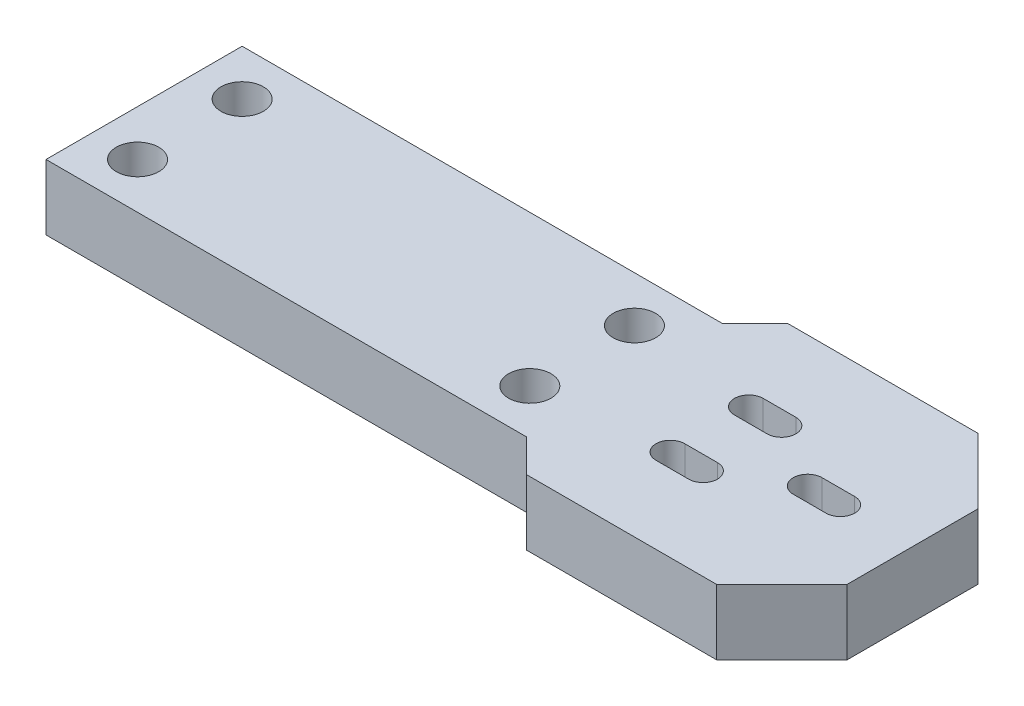
ISO-10303-21;
HEADER;
FILE_DESCRIPTION(('STEP AP214'),'2;1');
FILE_NAME('part.step','',(''),(''),'','','');
FILE_SCHEMA(('AUTOMOTIVE_DESIGN { 1 0 10303 214 1 1 1 1 }'));
ENDSEC;
DATA;
#1=APPLICATION_CONTEXT('core data for automotive mechanical design processes');
#2=APPLICATION_PROTOCOL_DEFINITION('international standard','automotive_design',2000,#1);
#3=PRODUCT_CONTEXT('',#1,'mechanical');
#4=PRODUCT('Part','Part','',(#3));
#5=PRODUCT_RELATED_PRODUCT_CATEGORY('part','',(#4));
#6=PRODUCT_DEFINITION_FORMATION('','',#4);
#7=PRODUCT_DEFINITION_CONTEXT('part definition',#1,'design');
#8=PRODUCT_DEFINITION('design','',#6,#7);
#9=PRODUCT_DEFINITION_SHAPE('','',#8);
#10=(LENGTH_UNIT() NAMED_UNIT(*) SI_UNIT(.MILLI.,.METRE.));
#11=(NAMED_UNIT(*) PLANE_ANGLE_UNIT() SI_UNIT($,.RADIAN.));
#12=(NAMED_UNIT(*) SI_UNIT($,.STERADIAN.) SOLID_ANGLE_UNIT());
#13=UNCERTAINTY_MEASURE_WITH_UNIT(LENGTH_MEASURE(1.E-05),#10,'distance_accuracy_value','');
#14=(GEOMETRIC_REPRESENTATION_CONTEXT(3) GLOBAL_UNCERTAINTY_ASSIGNED_CONTEXT((#13)) GLOBAL_UNIT_ASSIGNED_CONTEXT((#10,
#11,#12)) REPRESENTATION_CONTEXT('',''));
#15=CARTESIAN_POINT('',(0.,0.,0.));
#16=DIRECTION('',(0.,0.,1.));
#17=DIRECTION('',(1.,0.,0.));
#18=AXIS2_PLACEMENT_3D('',#15,#16,#17);
#19=CARTESIAN_POINT('',(0.,10.,0.));
#20=DIRECTION('',(0.,1.,0.));
#21=DIRECTION('',(0.,0.,1.));
#22=AXIS2_PLACEMENT_3D('',#19,#20,#21);
#23=PLANE('',#22);
#24=CARTESIAN_POINT('',(60.,10.,0.));
#25=DIRECTION('',(0.,1.,0.));
#26=DIRECTION('',(0.,0.,1.));
#27=AXIS2_PLACEMENT_3D('',#24,#25,#26);
#28=CIRCLE('',#27,3.25000000000001);
#29=CARTESIAN_POINT('',(60.,10.,3.25000000000001));
#30=VERTEX_POINT('',#29);
#31=EDGE_CURVE('E292',#30,#30,#28,.T.);
#32=ORIENTED_EDGE('',*,*,#31,.F.);
#33=EDGE_LOOP('',(#32));
#34=FACE_BOUND('',#33,.T.);
#35=CARTESIAN_POINT('',(0.,10.,0.));
#36=DIRECTION('',(0.,1.,0.));
#37=DIRECTION('',(0.,0.,1.));
#38=AXIS2_PLACEMENT_3D('',#35,#36,#37);
#39=CIRCLE('',#38,3.25);
#40=CARTESIAN_POINT('',(0.,10.,3.25));
#41=VERTEX_POINT('',#40);
#42=EDGE_CURVE('E304',#41,#41,#39,.T.);
#43=ORIENTED_EDGE('',*,*,#42,.F.);
#44=EDGE_LOOP('',(#43));
#45=FACE_BOUND('',#44,.T.);
#46=DIRECTION('',(1.,0.,0.));
#47=VECTOR('',#46,1.);
#48=CARTESIAN_POINT('',(66.5,10.,7.));
#49=LINE('',#48,#47);
#50=CARTESIAN_POINT('',(-7.,10.,7.));
#51=VERTEX_POINT('',#50);
#52=CARTESIAN_POINT('',(66.5,10.,7.));
#53=VERTEX_POINT('',#52);
#54=EDGE_CURVE('E316',#51,#53,#49,.T.);
#55=ORIENTED_EDGE('',*,*,#54,.T.);
#56=DIRECTION('',(-0.707106781186546,0.,-0.707106781186549));
#57=VECTOR('',#56,1.);
#58=CARTESIAN_POINT('',(29.7500000000001,10.,-29.75));
#59=LINE('',#58,#57);
#60=CARTESIAN_POINT('',(71.5,10.,12.));
#61=VERTEX_POINT('',#60);
#62=EDGE_CURVE('E41',#53,#61,#59,.F.);
#63=ORIENTED_EDGE('',*,*,#62,.T.);
#64=DIRECTION('',(1.,0.,0.));
#65=VECTOR('',#64,1.);
#66=CARTESIAN_POINT('',(110.551844539582,10.,12.));
#67=LINE('',#66,#65);
#68=CARTESIAN_POINT('',(100.551844539582,10.,12.));
#69=VERTEX_POINT('',#68);
#70=EDGE_CURVE('E318',#61,#69,#67,.T.);
#71=ORIENTED_EDGE('',*,*,#70,.T.);
#72=DIRECTION('',(-0.707106781186548,0.,0.707106781186547));
#73=VECTOR('',#72,1.);
#74=CARTESIAN_POINT('',(56.2759222697907,10.,56.2759222697909));
#75=LINE('',#74,#73);
#76=CARTESIAN_POINT('',(110.551844539582,10.,2.00000000000001));
#77=VERTEX_POINT('',#76);
#78=EDGE_CURVE('E365',#69,#77,#75,.F.);
#79=ORIENTED_EDGE('',*,*,#78,.T.);
#80=DIRECTION('',(0.,0.,-1.));
#81=VECTOR('',#80,1.);
#82=CARTESIAN_POINT('',(110.551844539582,10.,-28.));
#83=LINE('',#82,#81);
#84=CARTESIAN_POINT('',(110.551844539582,10.,-18.));
#85=VERTEX_POINT('',#84);
#86=EDGE_CURVE('E320',#77,#85,#83,.T.);
#87=ORIENTED_EDGE('',*,*,#86,.T.);
#88=DIRECTION('',(0.707106781186546,0.,0.70710678118655));
#89=VECTOR('',#88,1.);
#90=CARTESIAN_POINT('',(64.2759222697912,10.,-64.2759222697908));
#91=LINE('',#90,#89);
#92=CARTESIAN_POINT('',(100.551844539582,10.,-28.));
#93=VERTEX_POINT('',#92);
#94=EDGE_CURVE('E363',#85,#93,#91,.F.);
#95=ORIENTED_EDGE('',*,*,#94,.T.);
#96=DIRECTION('',(-1.,0.,0.));
#97=VECTOR('',#96,1.);
#98=CARTESIAN_POINT('',(66.5,10.,-28.));
#99=LINE('',#98,#97);
#100=CARTESIAN_POINT('',(71.5,10.,-28.));
#101=VERTEX_POINT('',#100);
#102=EDGE_CURVE('E323',#93,#101,#99,.T.);
#103=ORIENTED_EDGE('',*,*,#102,.T.);
#104=DIRECTION('',(0.707106781186549,0.,-0.707106781186547));
#105=VECTOR('',#104,1.);
#106=CARTESIAN_POINT('',(21.7499999999999,10.,21.75));
#107=LINE('',#106,#105);
#108=CARTESIAN_POINT('',(66.5,10.,-23.));
#109=VERTEX_POINT('',#108);
#110=EDGE_CURVE('E376',#101,#109,#107,.F.);
#111=ORIENTED_EDGE('',*,*,#110,.T.);
#112=DIRECTION('',(-1.,0.,0.));
#113=VECTOR('',#112,1.);
#114=CARTESIAN_POINT('',(-7.,10.,-23.));
#115=LINE('',#114,#113);
#116=CARTESIAN_POINT('',(-7.,10.,-23.));
#117=VERTEX_POINT('',#116);
#118=EDGE_CURVE('E310',#109,#117,#115,.T.);
#119=ORIENTED_EDGE('',*,*,#118,.T.);
#120=DIRECTION('',(0.,0.,1.));
#121=VECTOR('',#120,1.);
#122=CARTESIAN_POINT('',(-7.,10.,-23.));
#123=LINE('',#122,#121);
#124=EDGE_CURVE('E313',#117,#51,#123,.T.);
#125=ORIENTED_EDGE('',*,*,#124,.T.);
#126=EDGE_LOOP('',(#55,#63,#71,#79,#87,#95,#103,#111,#119,#125));
#127=FACE_BOUND('',#126,.T.);
#128=CARTESIAN_POINT('',(0.,10.,-16.));
#129=DIRECTION('',(0.,1.,0.));
#130=DIRECTION('',(0.,0.,1.));
#131=AXIS2_PLACEMENT_3D('',#128,#129,#130);
#132=CIRCLE('',#131,3.25);
#133=CARTESIAN_POINT('',(0.,10.,-12.75));
#134=VERTEX_POINT('',#133);
#135=EDGE_CURVE('E298',#134,#134,#132,.T.);
#136=ORIENTED_EDGE('',*,*,#135,.F.);
#137=EDGE_LOOP('',(#136));
#138=FACE_BOUND('',#137,.T.);
#139=CARTESIAN_POINT('',(60.,10.,-16.));
#140=DIRECTION('',(0.,1.,0.));
#141=DIRECTION('',(0.,0.,1.));
#142=AXIS2_PLACEMENT_3D('',#139,#140,#141);
#143=CIRCLE('',#142,3.25000000000001);
#144=CARTESIAN_POINT('',(60.,10.,-12.75));
#145=VERTEX_POINT('',#144);
#146=EDGE_CURVE('E286',#145,#145,#143,.T.);
#147=ORIENTED_EDGE('',*,*,#146,.F.);
#148=EDGE_LOOP('',(#147));
#149=FACE_BOUND('',#148,.T.);
#150=DIRECTION('',(-1.,0.,0.));
#151=VECTOR('',#150,1.);
#152=CARTESIAN_POINT('',(99.5,10.,-10.2));
#153=LINE('',#152,#151);
#154=CARTESIAN_POINT('',(99.5,10.,-10.2));
#155=VERTEX_POINT('',#154);
#156=CARTESIAN_POINT('',(94.5,10.,-10.2));
#157=VERTEX_POINT('',#156);
#158=EDGE_CURVE('E257',#155,#157,#153,.T.);
#159=ORIENTED_EDGE('',*,*,#158,.F.);
#160=CARTESIAN_POINT('',(99.5,10.,-8.));
#161=DIRECTION('',(0.,1.,0.));
#162=DIRECTION('',(0.,0.,1.));
#163=AXIS2_PLACEMENT_3D('',#160,#161,#162);
#164=CIRCLE('',#163,2.2);
#165=CARTESIAN_POINT('',(99.5,10.,-5.8));
#166=VERTEX_POINT('',#165);
#167=EDGE_CURVE('E255',#166,#155,#164,.T.);
#168=ORIENTED_EDGE('',*,*,#167,.F.);
#169=DIRECTION('',(1.,0.,0.));
#170=VECTOR('',#169,1.);
#171=CARTESIAN_POINT('',(99.5,10.,-5.8));
#172=LINE('',#171,#170);
#173=CARTESIAN_POINT('',(94.5,10.,-5.8));
#174=VERTEX_POINT('',#173);
#175=EDGE_CURVE('E263',#174,#166,#172,.T.);
#176=ORIENTED_EDGE('',*,*,#175,.F.);
#177=CARTESIAN_POINT('',(94.5,10.,-8.));
#178=DIRECTION('',(0.,1.,0.));
#179=DIRECTION('',(0.,0.,1.));
#180=AXIS2_PLACEMENT_3D('',#177,#178,#179);
#181=CIRCLE('',#180,2.2);
#182=EDGE_CURVE('E260',#157,#174,#181,.T.);
#183=ORIENTED_EDGE('',*,*,#182,.F.);
#184=EDGE_LOOP('',(#159,#168,#176,#183));
#185=FACE_BOUND('',#184,.T.);
#186=DIRECTION('',(-1.,0.,0.));
#187=VECTOR('',#186,1.);
#188=CARTESIAN_POINT('',(84.5,10.,-16.2));
#189=LINE('',#188,#187);
#190=CARTESIAN_POINT('',(84.5,10.,-16.2));
#191=VERTEX_POINT('',#190);
#192=CARTESIAN_POINT('',(79.5,10.,-16.2));
#193=VERTEX_POINT('',#192);
#194=EDGE_CURVE('E226',#191,#193,#189,.T.);
#195=ORIENTED_EDGE('',*,*,#194,.F.);
#196=CARTESIAN_POINT('',(84.5,10.,-14.));
#197=DIRECTION('',(0.,1.,0.));
#198=DIRECTION('',(0.,0.,1.));
#199=AXIS2_PLACEMENT_3D('',#196,#197,#198);
#200=CIRCLE('',#199,2.2);
#201=CARTESIAN_POINT('',(84.5,10.,-11.8));
#202=VERTEX_POINT('',#201);
#203=EDGE_CURVE('E224',#202,#191,#200,.T.);
#204=ORIENTED_EDGE('',*,*,#203,.F.);
#205=DIRECTION('',(1.,0.,0.));
#206=VECTOR('',#205,1.);
#207=CARTESIAN_POINT('',(84.5,10.,-11.8));
#208=LINE('',#207,#206);
#209=CARTESIAN_POINT('',(79.5,10.,-11.8));
#210=VERTEX_POINT('',#209);
#211=EDGE_CURVE('E232',#210,#202,#208,.T.);
#212=ORIENTED_EDGE('',*,*,#211,.F.);
#213=CARTESIAN_POINT('',(79.5,10.,-14.));
#214=DIRECTION('',(0.,1.,0.));
#215=DIRECTION('',(0.,0.,1.));
#216=AXIS2_PLACEMENT_3D('',#213,#214,#215);
#217=CIRCLE('',#216,2.2);
#218=EDGE_CURVE('E229',#193,#210,#217,.T.);
#219=ORIENTED_EDGE('',*,*,#218,.F.);
#220=EDGE_LOOP('',(#195,#204,#212,#219));
#221=FACE_BOUND('',#220,.T.);
#222=DIRECTION('',(-1.,0.,0.));
#223=VECTOR('',#222,1.);
#224=CARTESIAN_POINT('',(84.5,10.,-4.2));
#225=LINE('',#224,#223);
#226=CARTESIAN_POINT('',(84.5,10.,-4.2));
#227=VERTEX_POINT('',#226);
#228=CARTESIAN_POINT('',(79.5,10.,-4.2));
#229=VERTEX_POINT('',#228);
#230=EDGE_CURVE('E193',#227,#229,#225,.T.);
#231=ORIENTED_EDGE('',*,*,#230,.F.);
#232=CARTESIAN_POINT('',(84.5,10.,-2.));
#233=DIRECTION('',(0.,1.,0.));
#234=DIRECTION('',(0.,0.,1.));
#235=AXIS2_PLACEMENT_3D('',#232,#233,#234);
#236=CIRCLE('',#235,2.2);
#237=CARTESIAN_POINT('',(84.5,10.,0.200000000000003));
#238=VERTEX_POINT('',#237);
#239=EDGE_CURVE('E183',#238,#227,#236,.T.);
#240=ORIENTED_EDGE('',*,*,#239,.F.);
#241=DIRECTION('',(1.,0.,0.));
#242=VECTOR('',#241,1.);
#243=CARTESIAN_POINT('',(84.5,10.,0.200000000000003));
#244=LINE('',#243,#242);
#245=CARTESIAN_POINT('',(79.5,10.,0.200000000000004));
#246=VERTEX_POINT('',#245);
#247=EDGE_CURVE('E208',#246,#238,#244,.T.);
#248=ORIENTED_EDGE('',*,*,#247,.F.);
#249=CARTESIAN_POINT('',(79.5,10.,-2.));
#250=DIRECTION('',(0.,1.,0.));
#251=DIRECTION('',(0.,0.,1.));
#252=AXIS2_PLACEMENT_3D('',#249,#250,#251);
#253=CIRCLE('',#252,2.2);
#254=EDGE_CURVE('E206',#229,#246,#253,.T.);
#255=ORIENTED_EDGE('',*,*,#254,.F.);
#256=EDGE_LOOP('',(#231,#240,#248,#255));
#257=FACE_BOUND('',#256,.T.);
#258=ADVANCED_FACE('F33',(#34,#45,#127,#138,#149,#185,#221,#257),#23,.T.);
#259=CARTESIAN_POINT('',(0.,0.,0.));
#260=DIRECTION('',(0.,1.,0.));
#261=DIRECTION('',(0.,0.,1.));
#262=AXIS2_PLACEMENT_3D('',#259,#260,#261);
#263=PLANE('',#262);
#264=CARTESIAN_POINT('',(84.5,0.,-14.));
#265=DIRECTION('',(0.,1.,0.));
#266=DIRECTION('',(0.,0.,1.));
#267=AXIS2_PLACEMENT_3D('',#264,#265,#266);
#268=CIRCLE('',#267,2.2);
#269=CARTESIAN_POINT('',(84.5,0.,-11.8));
#270=VERTEX_POINT('',#269);
#271=CARTESIAN_POINT('',(84.5,0.,-16.2));
#272=VERTEX_POINT('',#271);
#273=EDGE_CURVE('E201',#270,#272,#268,.T.);
#274=ORIENTED_EDGE('',*,*,#273,.T.);
#275=DIRECTION('',(-1.,0.,0.));
#276=VECTOR('',#275,1.);
#277=CARTESIAN_POINT('',(84.5,0.,-16.2));
#278=LINE('',#277,#276);
#279=CARTESIAN_POINT('',(79.5,0.,-16.2));
#280=VERTEX_POINT('',#279);
#281=EDGE_CURVE('E237',#272,#280,#278,.T.);
#282=ORIENTED_EDGE('',*,*,#281,.T.);
#283=CARTESIAN_POINT('',(79.5,0.,-14.));
#284=DIRECTION('',(0.,1.,0.));
#285=DIRECTION('',(0.,0.,1.));
#286=AXIS2_PLACEMENT_3D('',#283,#284,#285);
#287=CIRCLE('',#286,2.2);
#288=CARTESIAN_POINT('',(79.5,0.,-11.8));
#289=VERTEX_POINT('',#288);
#290=EDGE_CURVE('E240',#280,#289,#287,.T.);
#291=ORIENTED_EDGE('',*,*,#290,.T.);
#292=DIRECTION('',(1.,0.,0.));
#293=VECTOR('',#292,1.);
#294=CARTESIAN_POINT('',(84.5,0.,-11.8));
#295=LINE('',#294,#293);
#296=EDGE_CURVE('E227',#289,#270,#295,.T.);
#297=ORIENTED_EDGE('',*,*,#296,.T.);
#298=EDGE_LOOP('',(#274,#282,#291,#297));
#299=FACE_BOUND('',#298,.T.);
#300=CARTESIAN_POINT('',(60.,0.,-16.));
#301=DIRECTION('',(0.,1.,0.));
#302=DIRECTION('',(0.,0.,1.));
#303=AXIS2_PLACEMENT_3D('',#300,#301,#302);
#304=CIRCLE('',#303,3.25000000000001);
#305=CARTESIAN_POINT('',(60.,0.,-12.75));
#306=VERTEX_POINT('',#305);
#307=EDGE_CURVE('E285',#306,#306,#304,.T.);
#308=ORIENTED_EDGE('',*,*,#307,.T.);
#309=EDGE_LOOP('',(#308));
#310=FACE_BOUND('',#309,.T.);
#311=CARTESIAN_POINT('',(60.,0.,0.));
#312=DIRECTION('',(0.,1.,0.));
#313=DIRECTION('',(0.,0.,1.));
#314=AXIS2_PLACEMENT_3D('',#311,#312,#313);
#315=CIRCLE('',#314,3.25000000000001);
#316=CARTESIAN_POINT('',(60.,0.,3.25000000000001));
#317=VERTEX_POINT('',#316);
#318=EDGE_CURVE('E289',#317,#317,#315,.T.);
#319=ORIENTED_EDGE('',*,*,#318,.T.);
#320=EDGE_LOOP('',(#319));
#321=FACE_BOUND('',#320,.T.);
#322=CARTESIAN_POINT('',(0.,0.,-16.));
#323=DIRECTION('',(0.,1.,0.));
#324=DIRECTION('',(0.,0.,1.));
#325=AXIS2_PLACEMENT_3D('',#322,#323,#324);
#326=CIRCLE('',#325,3.25);
#327=CARTESIAN_POINT('',(0.,0.,-12.75));
#328=VERTEX_POINT('',#327);
#329=EDGE_CURVE('E295',#328,#328,#326,.T.);
#330=ORIENTED_EDGE('',*,*,#329,.T.);
#331=EDGE_LOOP('',(#330));
#332=FACE_BOUND('',#331,.T.);
#333=CARTESIAN_POINT('',(0.,0.,0.));
#334=DIRECTION('',(0.,1.,0.));
#335=DIRECTION('',(0.,0.,1.));
#336=AXIS2_PLACEMENT_3D('',#333,#334,#335);
#337=CIRCLE('',#336,3.25);
#338=CARTESIAN_POINT('',(0.,0.,3.25));
#339=VERTEX_POINT('',#338);
#340=EDGE_CURVE('E301',#339,#339,#337,.T.);
#341=ORIENTED_EDGE('',*,*,#340,.T.);
#342=EDGE_LOOP('',(#341));
#343=FACE_BOUND('',#342,.T.);
#344=DIRECTION('',(1.,0.,0.));
#345=VECTOR('',#344,1.);
#346=CARTESIAN_POINT('',(110.551844539582,0.,12.));
#347=LINE('',#346,#345);
#348=CARTESIAN_POINT('',(71.5,0.,12.));
#349=VERTEX_POINT('',#348);
#350=CARTESIAN_POINT('',(100.551844539582,0.,12.));
#351=VERTEX_POINT('',#350);
#352=EDGE_CURVE('E333',#349,#351,#347,.T.);
#353=ORIENTED_EDGE('',*,*,#352,.F.);
#354=DIRECTION('',(0.707106781186546,0.,0.707106781186549));
#355=VECTOR('',#354,1.);
#356=CARTESIAN_POINT('',(71.5,0.,12.));
#357=LINE('',#356,#355);
#358=CARTESIAN_POINT('',(66.5,0.,7.));
#359=VERTEX_POINT('',#358);
#360=EDGE_CURVE('E374',#349,#359,#357,.F.);
#361=ORIENTED_EDGE('',*,*,#360,.T.);
#362=DIRECTION('',(1.,0.,0.));
#363=VECTOR('',#362,1.);
#364=CARTESIAN_POINT('',(66.5,0.,7.));
#365=LINE('',#364,#363);
#366=CARTESIAN_POINT('',(-7.,0.,7.));
#367=VERTEX_POINT('',#366);
#368=EDGE_CURVE('E330',#367,#359,#365,.T.);
#369=ORIENTED_EDGE('',*,*,#368,.F.);
#370=DIRECTION('',(0.,0.,1.));
#371=VECTOR('',#370,1.);
#372=CARTESIAN_POINT('',(-7.,0.,-23.));
#373=LINE('',#372,#371);
#374=CARTESIAN_POINT('',(-7.,0.,-23.));
#375=VERTEX_POINT('',#374);
#376=EDGE_CURVE('E328',#375,#367,#373,.T.);
#377=ORIENTED_EDGE('',*,*,#376,.F.);
#378=DIRECTION('',(-1.,0.,0.));
#379=VECTOR('',#378,1.);
#380=CARTESIAN_POINT('',(-7.,0.,-23.));
#381=LINE('',#380,#379);
#382=CARTESIAN_POINT('',(66.5,0.,-23.));
#383=VERTEX_POINT('',#382);
#384=EDGE_CURVE('E307',#383,#375,#381,.T.);
#385=ORIENTED_EDGE('',*,*,#384,.F.);
#386=DIRECTION('',(-0.707106781186549,0.,0.707106781186547));
#387=VECTOR('',#386,1.);
#388=CARTESIAN_POINT('',(66.5,0.,-23.));
#389=LINE('',#388,#387);
#390=CARTESIAN_POINT('',(71.5,0.,-28.));
#391=VERTEX_POINT('',#390);
#392=EDGE_CURVE('E54',#383,#391,#389,.F.);
#393=ORIENTED_EDGE('',*,*,#392,.T.);
#394=DIRECTION('',(-1.,0.,0.));
#395=VECTOR('',#394,1.);
#396=CARTESIAN_POINT('',(66.5,0.,-28.));
#397=LINE('',#396,#395);
#398=CARTESIAN_POINT('',(100.551844539582,0.,-28.));
#399=VERTEX_POINT('',#398);
#400=EDGE_CURVE('E314',#399,#391,#397,.T.);
#401=ORIENTED_EDGE('',*,*,#400,.F.);
#402=DIRECTION('',(-0.707106781186546,0.,-0.70710678118655));
#403=VECTOR('',#402,1.);
#404=CARTESIAN_POINT('',(100.551844539582,0.,-28.));
#405=LINE('',#404,#403);
#406=CARTESIAN_POINT('',(110.551844539582,0.,-18.));
#407=VERTEX_POINT('',#406);
#408=EDGE_CURVE('E355',#399,#407,#405,.F.);
#409=ORIENTED_EDGE('',*,*,#408,.T.);
#410=DIRECTION('',(0.,0.,-1.));
#411=VECTOR('',#410,1.);
#412=CARTESIAN_POINT('',(110.551844539582,0.,-28.));
#413=LINE('',#412,#411);
#414=CARTESIAN_POINT('',(110.551844539582,0.,2.00000000000001));
#415=VERTEX_POINT('',#414);
#416=EDGE_CURVE('E335',#415,#407,#413,.T.);
#417=ORIENTED_EDGE('',*,*,#416,.F.);
#418=DIRECTION('',(0.707106781186548,0.,-0.707106781186547));
#419=VECTOR('',#418,1.);
#420=CARTESIAN_POINT('',(110.551844539582,0.,2.00000000000001));
#421=LINE('',#420,#419);
#422=EDGE_CURVE('E357',#415,#351,#421,.F.);
#423=ORIENTED_EDGE('',*,*,#422,.T.);
#424=EDGE_LOOP('',(#353,#361,#369,#377,#385,#393,#401,#409,#417,#423));
#425=FACE_BOUND('',#424,.T.);
#426=CARTESIAN_POINT('',(99.5,0.,-8.));
#427=DIRECTION('',(0.,1.,0.));
#428=DIRECTION('',(0.,0.,1.));
#429=AXIS2_PLACEMENT_3D('',#426,#427,#428);
#430=CIRCLE('',#429,2.2);
#431=CARTESIAN_POINT('',(99.5,0.,-5.8));
#432=VERTEX_POINT('',#431);
#433=CARTESIAN_POINT('',(99.5,0.,-10.2));
#434=VERTEX_POINT('',#433);
#435=EDGE_CURVE('E254',#432,#434,#430,.T.);
#436=ORIENTED_EDGE('',*,*,#435,.T.);
#437=DIRECTION('',(-1.,0.,0.));
#438=VECTOR('',#437,1.);
#439=CARTESIAN_POINT('',(99.5,0.,-10.2));
#440=LINE('',#439,#438);
#441=CARTESIAN_POINT('',(94.5,0.,-10.2));
#442=VERTEX_POINT('',#441);
#443=EDGE_CURVE('E268',#434,#442,#440,.T.);
#444=ORIENTED_EDGE('',*,*,#443,.T.);
#445=CARTESIAN_POINT('',(94.5,0.,-8.));
#446=DIRECTION('',(0.,1.,0.));
#447=DIRECTION('',(0.,0.,1.));
#448=AXIS2_PLACEMENT_3D('',#445,#446,#447);
#449=CIRCLE('',#448,2.2);
#450=CARTESIAN_POINT('',(94.5,0.,-5.8));
#451=VERTEX_POINT('',#450);
#452=EDGE_CURVE('E271',#442,#451,#449,.T.);
#453=ORIENTED_EDGE('',*,*,#452,.T.);
#454=DIRECTION('',(1.,0.,0.));
#455=VECTOR('',#454,1.);
#456=CARTESIAN_POINT('',(99.5,0.,-5.8));
#457=LINE('',#456,#455);
#458=EDGE_CURVE('E258',#451,#432,#457,.T.);
#459=ORIENTED_EDGE('',*,*,#458,.T.);
#460=EDGE_LOOP('',(#436,#444,#453,#459));
#461=FACE_BOUND('',#460,.T.);
#462=CARTESIAN_POINT('',(84.5,0.,-2.));
#463=DIRECTION('',(0.,1.,0.));
#464=DIRECTION('',(0.,0.,1.));
#465=AXIS2_PLACEMENT_3D('',#462,#463,#464);
#466=CIRCLE('',#465,2.2);
#467=CARTESIAN_POINT('',(84.5,0.,0.200000000000003));
#468=VERTEX_POINT('',#467);
#469=CARTESIAN_POINT('',(84.5,0.,-4.2));
#470=VERTEX_POINT('',#469);
#471=EDGE_CURVE('E212',#468,#470,#466,.T.);
#472=ORIENTED_EDGE('',*,*,#471,.T.);
#473=DIRECTION('',(-1.,0.,0.));
#474=VECTOR('',#473,1.);
#475=CARTESIAN_POINT('',(84.5,0.,-4.2));
#476=LINE('',#475,#474);
#477=CARTESIAN_POINT('',(79.5,0.,-4.2));
#478=VERTEX_POINT('',#477);
#479=EDGE_CURVE('E200',#470,#478,#476,.T.);
#480=ORIENTED_EDGE('',*,*,#479,.T.);
#481=CARTESIAN_POINT('',(79.5,0.,-2.));
#482=DIRECTION('',(0.,1.,0.));
#483=DIRECTION('',(0.,0.,1.));
#484=AXIS2_PLACEMENT_3D('',#481,#482,#483);
#485=CIRCLE('',#484,2.2);
#486=CARTESIAN_POINT('',(79.5,0.,0.200000000000004));
#487=VERTEX_POINT('',#486);
#488=EDGE_CURVE('E215',#478,#487,#485,.T.);
#489=ORIENTED_EDGE('',*,*,#488,.T.);
#490=DIRECTION('',(1.,0.,0.));
#491=VECTOR('',#490,1.);
#492=CARTESIAN_POINT('',(84.5,0.,0.200000000000003));
#493=LINE('',#492,#491);
#494=EDGE_CURVE('E194',#487,#468,#493,.T.);
#495=ORIENTED_EDGE('',*,*,#494,.T.);
#496=EDGE_LOOP('',(#472,#480,#489,#495));
#497=FACE_BOUND('',#496,.T.);
#498=ADVANCED_FACE('F392',(#299,#310,#321,#332,#343,#425,#461,#497),#263,.F.);
#499=CARTESIAN_POINT('',(-7.,10.,-23.));
#500=DIRECTION('',(0.,0.,1.));
#501=DIRECTION('',(1.,0.,0.));
#502=AXIS2_PLACEMENT_3D('',#499,#500,#501);
#503=PLANE('',#502);
#504=ORIENTED_EDGE('',*,*,#384,.T.);
#505=DIRECTION('',(0.,-1.,0.));
#506=VECTOR('',#505,1.);
#507=CARTESIAN_POINT('',(-7.,10.,-23.));
#508=LINE('',#507,#506);
#509=EDGE_CURVE('E347',#117,#375,#508,.T.);
#510=ORIENTED_EDGE('',*,*,#509,.F.);
#511=ORIENTED_EDGE('',*,*,#118,.F.);
#512=DIRECTION('',(0.,-1.,0.));
#513=VECTOR('',#512,1.);
#514=CARTESIAN_POINT('',(66.5,10.,-23.));
#515=LINE('',#514,#513);
#516=EDGE_CURVE('E325',#109,#383,#515,.T.);
#517=ORIENTED_EDGE('',*,*,#516,.T.);
#518=EDGE_LOOP('',(#504,#510,#511,#517));
#519=FACE_BOUND('',#518,.T.);
#520=ADVANCED_FACE('F401',(#519),#503,.F.);
#521=CARTESIAN_POINT('',(-7.,10.,-23.));
#522=DIRECTION('',(1.,0.,0.));
#523=DIRECTION('',(0.,0.,-1.));
#524=AXIS2_PLACEMENT_3D('',#521,#522,#523);
#525=PLANE('',#524);
#526=ORIENTED_EDGE('',*,*,#376,.T.);
#527=DIRECTION('',(0.,-1.,0.));
#528=VECTOR('',#527,1.);
#529=CARTESIAN_POINT('',(-7.,10.,7.));
#530=LINE('',#529,#528);
#531=EDGE_CURVE('E344',#51,#367,#530,.T.);
#532=ORIENTED_EDGE('',*,*,#531,.F.);
#533=ORIENTED_EDGE('',*,*,#124,.F.);
#534=ORIENTED_EDGE('',*,*,#509,.T.);
#535=EDGE_LOOP('',(#526,#532,#533,#534));
#536=FACE_BOUND('',#535,.T.);
#537=ADVANCED_FACE('F398',(#536),#525,.F.);
#538=CARTESIAN_POINT('',(66.5,10.,7.));
#539=DIRECTION('',(0.,0.,-1.));
#540=DIRECTION('',(-1.,0.,0.));
#541=AXIS2_PLACEMENT_3D('',#538,#539,#540);
#542=PLANE('',#541);
#543=ORIENTED_EDGE('',*,*,#368,.T.);
#544=DIRECTION('',(0.,-1.,0.));
#545=VECTOR('',#544,1.);
#546=CARTESIAN_POINT('',(66.5,10.,7.));
#547=LINE('',#546,#545);
#548=EDGE_CURVE('E341',#53,#359,#547,.T.);
#549=ORIENTED_EDGE('',*,*,#548,.F.);
#550=ORIENTED_EDGE('',*,*,#54,.F.);
#551=ORIENTED_EDGE('',*,*,#531,.T.);
#552=EDGE_LOOP('',(#543,#549,#550,#551));
#553=FACE_BOUND('',#552,.T.);
#554=ADVANCED_FACE('F395',(#553),#542,.F.);
#555=CARTESIAN_POINT('',(110.551844539582,10.,12.));
#556=DIRECTION('',(0.,0.,-1.));
#557=DIRECTION('',(-1.,0.,0.));
#558=AXIS2_PLACEMENT_3D('',#555,#556,#557);
#559=PLANE('',#558);
#560=ORIENTED_EDGE('',*,*,#70,.F.);
#561=DIRECTION('',(0.,-1.,0.));
#562=VECTOR('',#561,1.);
#563=CARTESIAN_POINT('',(71.5,10.,12.));
#564=LINE('',#563,#562);
#565=EDGE_CURVE('E370',#61,#349,#564,.T.);
#566=ORIENTED_EDGE('',*,*,#565,.T.);
#567=ORIENTED_EDGE('',*,*,#352,.T.);
#568=DIRECTION('',(0.,1.,0.));
#569=VECTOR('',#568,1.);
#570=CARTESIAN_POINT('',(100.551844539582,10.,12.));
#571=LINE('',#570,#569);
#572=EDGE_CURVE('E360',#351,#69,#571,.T.);
#573=ORIENTED_EDGE('',*,*,#572,.T.);
#574=EDGE_LOOP('',(#560,#566,#567,#573));
#575=FACE_BOUND('',#574,.T.);
#576=ADVANCED_FACE('F386',(#575),#559,.F.);
#577=CARTESIAN_POINT('',(110.551844539582,10.,-28.));
#578=DIRECTION('',(-1.,0.,0.));
#579=DIRECTION('',(0.,0.,1.));
#580=AXIS2_PLACEMENT_3D('',#577,#578,#579);
#581=PLANE('',#580);
#582=ORIENTED_EDGE('',*,*,#86,.F.);
#583=DIRECTION('',(0.,-1.,0.));
#584=VECTOR('',#583,1.);
#585=CARTESIAN_POINT('',(110.551844539582,10.,2.00000000000001));
#586=LINE('',#585,#584);
#587=EDGE_CURVE('E352',#77,#415,#586,.T.);
#588=ORIENTED_EDGE('',*,*,#587,.T.);
#589=ORIENTED_EDGE('',*,*,#416,.T.);
#590=DIRECTION('',(0.,1.,0.));
#591=VECTOR('',#590,1.);
#592=CARTESIAN_POINT('',(110.551844539582,10.,-18.));
#593=LINE('',#592,#591);
#594=EDGE_CURVE('E350',#407,#85,#593,.T.);
#595=ORIENTED_EDGE('',*,*,#594,.T.);
#596=EDGE_LOOP('',(#582,#588,#589,#595));
#597=FACE_BOUND('',#596,.T.);
#598=ADVANCED_FACE('F415',(#597),#581,.F.);
#599=CARTESIAN_POINT('',(66.5,10.,-28.));
#600=DIRECTION('',(0.,0.,1.));
#601=DIRECTION('',(1.,0.,0.));
#602=AXIS2_PLACEMENT_3D('',#599,#600,#601);
#603=PLANE('',#602);
#604=ORIENTED_EDGE('',*,*,#400,.T.);
#605=DIRECTION('',(0.,1.,0.));
#606=VECTOR('',#605,1.);
#607=CARTESIAN_POINT('',(71.5,10.,-28.));
#608=LINE('',#607,#606);
#609=EDGE_CURVE('E11',#391,#101,#608,.T.);
#610=ORIENTED_EDGE('',*,*,#609,.T.);
#611=ORIENTED_EDGE('',*,*,#102,.F.);
#612=DIRECTION('',(0.,-1.,0.));
#613=VECTOR('',#612,1.);
#614=CARTESIAN_POINT('',(100.551844539582,10.,-28.));
#615=LINE('',#614,#613);
#616=EDGE_CURVE('E367',#93,#399,#615,.T.);
#617=ORIENTED_EDGE('',*,*,#616,.T.);
#618=EDGE_LOOP('',(#604,#610,#611,#617));
#619=FACE_BOUND('',#618,.T.);
#620=ADVANCED_FACE('F408',(#619),#603,.F.);
#621=CARTESIAN_POINT('',(0.,10.,0.));
#622=DIRECTION('',(0.,-1.,0.));
#623=DIRECTION('',(0.,0.,-1.));
#624=AXIS2_PLACEMENT_3D('',#621,#622,#623);
#625=CYLINDRICAL_SURFACE('',#624,3.25);
#626=ORIENTED_EDGE('',*,*,#42,.T.);
#627=EDGE_LOOP('',(#626));
#628=FACE_BOUND('',#627,.T.);
#629=ORIENTED_EDGE('',*,*,#340,.F.);
#630=EDGE_LOOP('',(#629));
#631=FACE_BOUND('',#630,.T.);
#632=ADVANCED_FACE('F442',(#628,#631),#625,.F.);
#633=CARTESIAN_POINT('',(0.,10.,-16.));
#634=DIRECTION('',(0.,-1.,0.));
#635=DIRECTION('',(0.,0.,-1.));
#636=AXIS2_PLACEMENT_3D('',#633,#634,#635);
#637=CYLINDRICAL_SURFACE('',#636,3.25);
#638=ORIENTED_EDGE('',*,*,#135,.T.);
#639=EDGE_LOOP('',(#638));
#640=FACE_BOUND('',#639,.T.);
#641=ORIENTED_EDGE('',*,*,#329,.F.);
#642=EDGE_LOOP('',(#641));
#643=FACE_BOUND('',#642,.T.);
#644=ADVANCED_FACE('F487',(#640,#643),#637,.F.);
#645=CARTESIAN_POINT('',(60.,10.,0.));
#646=DIRECTION('',(0.,-1.,0.));
#647=DIRECTION('',(0.,0.,-1.));
#648=AXIS2_PLACEMENT_3D('',#645,#646,#647);
#649=CYLINDRICAL_SURFACE('',#648,3.25000000000001);
#650=ORIENTED_EDGE('',*,*,#31,.T.);
#651=EDGE_LOOP('',(#650));
#652=FACE_BOUND('',#651,.T.);
#653=ORIENTED_EDGE('',*,*,#318,.F.);
#654=EDGE_LOOP('',(#653));
#655=FACE_BOUND('',#654,.T.);
#656=ADVANCED_FACE('F494',(#652,#655),#649,.F.);
#657=CARTESIAN_POINT('',(60.,10.,-16.));
#658=DIRECTION('',(0.,-1.,0.));
#659=DIRECTION('',(0.,0.,-1.));
#660=AXIS2_PLACEMENT_3D('',#657,#658,#659);
#661=CYLINDRICAL_SURFACE('',#660,3.25000000000001);
#662=ORIENTED_EDGE('',*,*,#146,.T.);
#663=EDGE_LOOP('',(#662));
#664=FACE_BOUND('',#663,.T.);
#665=ORIENTED_EDGE('',*,*,#307,.F.);
#666=EDGE_LOOP('',(#665));
#667=FACE_BOUND('',#666,.T.);
#668=ADVANCED_FACE('F501',(#664,#667),#661,.F.);
#669=CARTESIAN_POINT('',(99.5,10.,-8.));
#670=DIRECTION('',(0.,-1.,0.));
#671=DIRECTION('',(0.,0.,-1.));
#672=AXIS2_PLACEMENT_3D('',#669,#670,#671);
#673=CYLINDRICAL_SURFACE('',#672,2.2);
#674=ORIENTED_EDGE('',*,*,#435,.F.);
#675=DIRECTION('',(0.,-1.,0.));
#676=VECTOR('',#675,1.);
#677=CARTESIAN_POINT('',(99.5,10.,-5.8));
#678=LINE('',#677,#676);
#679=EDGE_CURVE('E265',#166,#432,#678,.T.);
#680=ORIENTED_EDGE('',*,*,#679,.F.);
#681=ORIENTED_EDGE('',*,*,#167,.T.);
#682=DIRECTION('',(0.,-1.,0.));
#683=VECTOR('',#682,1.);
#684=CARTESIAN_POINT('',(99.5,10.,-10.2));
#685=LINE('',#684,#683);
#686=EDGE_CURVE('E282',#155,#434,#685,.T.);
#687=ORIENTED_EDGE('',*,*,#686,.T.);
#688=EDGE_LOOP('',(#674,#680,#681,#687));
#689=FACE_BOUND('',#688,.T.);
#690=ADVANCED_FACE('F509',(#689),#673,.F.);
#691=CARTESIAN_POINT('',(99.5,10.,-10.2));
#692=DIRECTION('',(0.,0.,1.));
#693=DIRECTION('',(1.,0.,0.));
#694=AXIS2_PLACEMENT_3D('',#691,#692,#693);
#695=PLANE('',#694);
#696=ORIENTED_EDGE('',*,*,#443,.F.);
#697=ORIENTED_EDGE('',*,*,#686,.F.);
#698=ORIENTED_EDGE('',*,*,#158,.T.);
#699=DIRECTION('',(0.,-1.,0.));
#700=VECTOR('',#699,1.);
#701=CARTESIAN_POINT('',(94.5,10.,-10.2));
#702=LINE('',#701,#700);
#703=EDGE_CURVE('E280',#157,#442,#702,.T.);
#704=ORIENTED_EDGE('',*,*,#703,.T.);
#705=EDGE_LOOP('',(#696,#697,#698,#704));
#706=FACE_BOUND('',#705,.T.);
#707=ADVANCED_FACE('F517',(#706),#695,.T.);
#708=CARTESIAN_POINT('',(94.5,10.,-8.));
#709=DIRECTION('',(0.,-1.,0.));
#710=DIRECTION('',(0.,0.,-1.));
#711=AXIS2_PLACEMENT_3D('',#708,#709,#710);
#712=CYLINDRICAL_SURFACE('',#711,2.2);
#713=ORIENTED_EDGE('',*,*,#452,.F.);
#714=ORIENTED_EDGE('',*,*,#703,.F.);
#715=ORIENTED_EDGE('',*,*,#182,.T.);
#716=DIRECTION('',(0.,-1.,0.));
#717=VECTOR('',#716,1.);
#718=CARTESIAN_POINT('',(94.5,10.,-5.8));
#719=LINE('',#718,#717);
#720=EDGE_CURVE('E278',#174,#451,#719,.T.);
#721=ORIENTED_EDGE('',*,*,#720,.T.);
#722=EDGE_LOOP('',(#713,#714,#715,#721));
#723=FACE_BOUND('',#722,.T.);
#724=ADVANCED_FACE('F525',(#723),#712,.F.);
#725=CARTESIAN_POINT('',(99.5,10.,-5.8));
#726=DIRECTION('',(0.,0.,-1.));
#727=DIRECTION('',(-1.,0.,0.));
#728=AXIS2_PLACEMENT_3D('',#725,#726,#727);
#729=PLANE('',#728);
#730=ORIENTED_EDGE('',*,*,#458,.F.);
#731=ORIENTED_EDGE('',*,*,#720,.F.);
#732=ORIENTED_EDGE('',*,*,#175,.T.);
#733=ORIENTED_EDGE('',*,*,#679,.T.);
#734=EDGE_LOOP('',(#730,#731,#732,#733));
#735=FACE_BOUND('',#734,.T.);
#736=ADVANCED_FACE('F533',(#735),#729,.T.);
#737=CARTESIAN_POINT('',(84.5,10.,-14.));
#738=DIRECTION('',(0.,-1.,0.));
#739=DIRECTION('',(0.,0.,-1.));
#740=AXIS2_PLACEMENT_3D('',#737,#738,#739);
#741=CYLINDRICAL_SURFACE('',#740,2.2);
#742=ORIENTED_EDGE('',*,*,#273,.F.);
#743=DIRECTION('',(0.,-1.,0.));
#744=VECTOR('',#743,1.);
#745=CARTESIAN_POINT('',(84.5,10.,-11.8));
#746=LINE('',#745,#744);
#747=EDGE_CURVE('E234',#202,#270,#746,.T.);
#748=ORIENTED_EDGE('',*,*,#747,.F.);
#749=ORIENTED_EDGE('',*,*,#203,.T.);
#750=DIRECTION('',(0.,-1.,0.));
#751=VECTOR('',#750,1.);
#752=CARTESIAN_POINT('',(84.5,10.,-16.2));
#753=LINE('',#752,#751);
#754=EDGE_CURVE('E251',#191,#272,#753,.T.);
#755=ORIENTED_EDGE('',*,*,#754,.T.);
#756=EDGE_LOOP('',(#742,#748,#749,#755));
#757=FACE_BOUND('',#756,.T.);
#758=ADVANCED_FACE('F541',(#757),#741,.F.);
#759=CARTESIAN_POINT('',(84.5,10.,-16.2));
#760=DIRECTION('',(0.,0.,1.));
#761=DIRECTION('',(1.,0.,0.));
#762=AXIS2_PLACEMENT_3D('',#759,#760,#761);
#763=PLANE('',#762);
#764=ORIENTED_EDGE('',*,*,#281,.F.);
#765=ORIENTED_EDGE('',*,*,#754,.F.);
#766=ORIENTED_EDGE('',*,*,#194,.T.);
#767=DIRECTION('',(0.,-1.,0.));
#768=VECTOR('',#767,1.);
#769=CARTESIAN_POINT('',(79.5,10.,-16.2));
#770=LINE('',#769,#768);
#771=EDGE_CURVE('E249',#193,#280,#770,.T.);
#772=ORIENTED_EDGE('',*,*,#771,.T.);
#773=EDGE_LOOP('',(#764,#765,#766,#772));
#774=FACE_BOUND('',#773,.T.);
#775=ADVANCED_FACE('F549',(#774),#763,.T.);
#776=CARTESIAN_POINT('',(79.5,10.,-14.));
#777=DIRECTION('',(0.,-1.,0.));
#778=DIRECTION('',(0.,0.,-1.));
#779=AXIS2_PLACEMENT_3D('',#776,#777,#778);
#780=CYLINDRICAL_SURFACE('',#779,2.2);
#781=ORIENTED_EDGE('',*,*,#290,.F.);
#782=ORIENTED_EDGE('',*,*,#771,.F.);
#783=ORIENTED_EDGE('',*,*,#218,.T.);
#784=DIRECTION('',(0.,-1.,0.));
#785=VECTOR('',#784,1.);
#786=CARTESIAN_POINT('',(79.5,10.,-11.8));
#787=LINE('',#786,#785);
#788=EDGE_CURVE('E247',#210,#289,#787,.T.);
#789=ORIENTED_EDGE('',*,*,#788,.T.);
#790=EDGE_LOOP('',(#781,#782,#783,#789));
#791=FACE_BOUND('',#790,.T.);
#792=ADVANCED_FACE('F557',(#791),#780,.F.);
#793=CARTESIAN_POINT('',(84.5,10.,-11.8));
#794=DIRECTION('',(0.,0.,-1.));
#795=DIRECTION('',(-1.,0.,0.));
#796=AXIS2_PLACEMENT_3D('',#793,#794,#795);
#797=PLANE('',#796);
#798=ORIENTED_EDGE('',*,*,#296,.F.);
#799=ORIENTED_EDGE('',*,*,#788,.F.);
#800=ORIENTED_EDGE('',*,*,#211,.T.);
#801=ORIENTED_EDGE('',*,*,#747,.T.);
#802=EDGE_LOOP('',(#798,#799,#800,#801));
#803=FACE_BOUND('',#802,.T.);
#804=ADVANCED_FACE('F565',(#803),#797,.T.);
#805=CARTESIAN_POINT('',(84.5,10.,-2.));
#806=DIRECTION('',(0.,-1.,0.));
#807=DIRECTION('',(0.,0.,-1.));
#808=AXIS2_PLACEMENT_3D('',#805,#806,#807);
#809=CYLINDRICAL_SURFACE('',#808,2.2);
#810=ORIENTED_EDGE('',*,*,#471,.F.);
#811=DIRECTION('',(0.,-1.,0.));
#812=VECTOR('',#811,1.);
#813=CARTESIAN_POINT('',(84.5,10.,0.200000000000003));
#814=LINE('',#813,#812);
#815=EDGE_CURVE('E189',#238,#468,#814,.T.);
#816=ORIENTED_EDGE('',*,*,#815,.F.);
#817=ORIENTED_EDGE('',*,*,#239,.T.);
#818=DIRECTION('',(0.,-1.,0.));
#819=VECTOR('',#818,1.);
#820=CARTESIAN_POINT('',(84.5,10.,-4.2));
#821=LINE('',#820,#819);
#822=EDGE_CURVE('E186',#227,#470,#821,.T.);
#823=ORIENTED_EDGE('',*,*,#822,.T.);
#824=EDGE_LOOP('',(#810,#816,#817,#823));
#825=FACE_BOUND('',#824,.T.);
#826=ADVANCED_FACE('F185',(#825),#809,.F.);
#827=CARTESIAN_POINT('',(84.5,10.,-4.2));
#828=DIRECTION('',(0.,0.,1.));
#829=DIRECTION('',(1.,0.,0.));
#830=AXIS2_PLACEMENT_3D('',#827,#828,#829);
#831=PLANE('',#830);
#832=ORIENTED_EDGE('',*,*,#479,.F.);
#833=ORIENTED_EDGE('',*,*,#822,.F.);
#834=ORIENTED_EDGE('',*,*,#230,.T.);
#835=DIRECTION('',(0.,-1.,0.));
#836=VECTOR('',#835,1.);
#837=CARTESIAN_POINT('',(79.5,10.,-4.2));
#838=LINE('',#837,#836);
#839=EDGE_CURVE('E202',#229,#478,#838,.T.);
#840=ORIENTED_EDGE('',*,*,#839,.T.);
#841=EDGE_LOOP('',(#832,#833,#834,#840));
#842=FACE_BOUND('',#841,.T.);
#843=ADVANCED_FACE('F197',(#842),#831,.T.);
#844=CARTESIAN_POINT('',(79.5,10.,-2.));
#845=DIRECTION('',(0.,-1.,0.));
#846=DIRECTION('',(0.,0.,-1.));
#847=AXIS2_PLACEMENT_3D('',#844,#845,#846);
#848=CYLINDRICAL_SURFACE('',#847,2.2);
#849=ORIENTED_EDGE('',*,*,#488,.F.);
#850=ORIENTED_EDGE('',*,*,#839,.F.);
#851=ORIENTED_EDGE('',*,*,#254,.T.);
#852=DIRECTION('',(0.,-1.,0.));
#853=VECTOR('',#852,1.);
#854=CARTESIAN_POINT('',(79.5,10.,0.200000000000004));
#855=LINE('',#854,#853);
#856=EDGE_CURVE('E221',#246,#487,#855,.T.);
#857=ORIENTED_EDGE('',*,*,#856,.T.);
#858=EDGE_LOOP('',(#849,#850,#851,#857));
#859=FACE_BOUND('',#858,.T.);
#860=ADVANCED_FACE('F427',(#859),#848,.F.);
#861=CARTESIAN_POINT('',(84.5,10.,0.200000000000003));
#862=DIRECTION('',(0.,0.,-1.));
#863=DIRECTION('',(-1.,0.,0.));
#864=AXIS2_PLACEMENT_3D('',#861,#862,#863);
#865=PLANE('',#864);
#866=ORIENTED_EDGE('',*,*,#494,.F.);
#867=ORIENTED_EDGE('',*,*,#856,.F.);
#868=ORIENTED_EDGE('',*,*,#247,.T.);
#869=ORIENTED_EDGE('',*,*,#815,.T.);
#870=EDGE_LOOP('',(#866,#867,#868,#869));
#871=FACE_BOUND('',#870,.T.);
#872=ADVANCED_FACE('F420',(#871),#865,.T.);
#873=CARTESIAN_POINT('',(110.551844539582,10.,2.00000000000001));
#874=DIRECTION('',(-0.707106781186547,0.,-0.707106781186548));
#875=DIRECTION('',(0.,-1.,0.));
#876=AXIS2_PLACEMENT_3D('',#873,#874,#875);
#877=PLANE('',#876);
#878=ORIENTED_EDGE('',*,*,#78,.F.);
#879=ORIENTED_EDGE('',*,*,#572,.F.);
#880=ORIENTED_EDGE('',*,*,#422,.F.);
#881=ORIENTED_EDGE('',*,*,#587,.F.);
#882=EDGE_LOOP('',(#878,#879,#880,#881));
#883=FACE_BOUND('',#882,.T.);
#884=ADVANCED_FACE('F418',(#883),#877,.F.);
#885=CARTESIAN_POINT('',(100.551844539582,10.,-28.));
#886=DIRECTION('',(-0.70710678118655,0.,0.707106781186546));
#887=DIRECTION('',(0.,-1.,0.));
#888=AXIS2_PLACEMENT_3D('',#885,#886,#887);
#889=PLANE('',#888);
#890=ORIENTED_EDGE('',*,*,#94,.F.);
#891=ORIENTED_EDGE('',*,*,#594,.F.);
#892=ORIENTED_EDGE('',*,*,#408,.F.);
#893=ORIENTED_EDGE('',*,*,#616,.F.);
#894=EDGE_LOOP('',(#890,#891,#892,#893));
#895=FACE_BOUND('',#894,.T.);
#896=ADVANCED_FACE('F410',(#895),#889,.F.);
#897=CARTESIAN_POINT('',(71.5,10.,12.));
#898=DIRECTION('',(0.707106781186549,0.,-0.707106781186546));
#899=DIRECTION('',(0.,-1.,0.));
#900=AXIS2_PLACEMENT_3D('',#897,#898,#899);
#901=PLANE('',#900);
#902=ORIENTED_EDGE('',*,*,#62,.F.);
#903=ORIENTED_EDGE('',*,*,#548,.T.);
#904=ORIENTED_EDGE('',*,*,#360,.F.);
#905=ORIENTED_EDGE('',*,*,#565,.F.);
#906=EDGE_LOOP('',(#902,#903,#904,#905));
#907=FACE_BOUND('',#906,.T.);
#908=ADVANCED_FACE('F390',(#907),#901,.F.);
#909=CARTESIAN_POINT('',(66.5,10.,-23.));
#910=DIRECTION('',(0.707106781186547,0.,0.707106781186549));
#911=DIRECTION('',(0.,-1.,0.));
#912=AXIS2_PLACEMENT_3D('',#909,#910,#911);
#913=PLANE('',#912);
#914=ORIENTED_EDGE('',*,*,#110,.F.);
#915=ORIENTED_EDGE('',*,*,#609,.F.);
#916=ORIENTED_EDGE('',*,*,#392,.F.);
#917=ORIENTED_EDGE('',*,*,#516,.F.);
#918=EDGE_LOOP('',(#914,#915,#916,#917));
#919=FACE_BOUND('',#918,.T.);
#920=ADVANCED_FACE('F35',(#919),#913,.F.);
#921=CLOSED_SHELL('',(#258,#498,#520,#537,#554,#576,#598,#620,#632,#644,#656,#668,#690,#707,
#724,#736,#758,#775,#792,#804,#826,#843,#860,#872,#884,#896,#908,#920));
#922=MANIFOLD_SOLID_BREP('B2',#921);
#923=ADVANCED_BREP_SHAPE_REPRESENTATION('',(#18,#922),#14);
#924=SHAPE_DEFINITION_REPRESENTATION(#9,#923);
ENDSEC;
END-ISO-10303-21;
